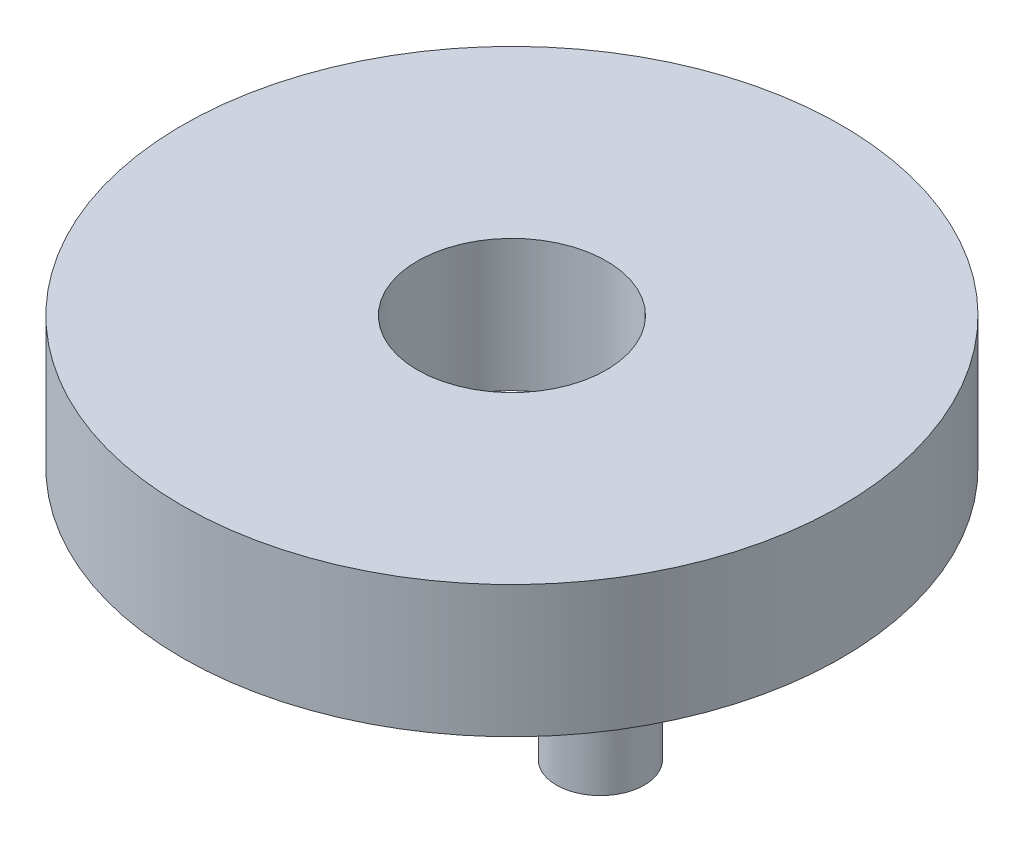
ISO-10303-21;
HEADER;
FILE_DESCRIPTION(('STEP AP214'),'2;1');
FILE_NAME('part.step','',(''),(''),'','','');
FILE_SCHEMA(('AUTOMOTIVE_DESIGN { 1 0 10303 214 1 1 1 1 }'));
ENDSEC;
DATA;
#1=APPLICATION_CONTEXT('core data for automotive mechanical design processes');
#2=APPLICATION_PROTOCOL_DEFINITION('international standard','automotive_design',2000,#1);
#3=PRODUCT_CONTEXT('',#1,'mechanical');
#4=PRODUCT('Part','Part','',(#3));
#5=PRODUCT_RELATED_PRODUCT_CATEGORY('part','',(#4));
#6=PRODUCT_DEFINITION_FORMATION('','',#4);
#7=PRODUCT_DEFINITION_CONTEXT('part definition',#1,'design');
#8=PRODUCT_DEFINITION('design','',#6,#7);
#9=PRODUCT_DEFINITION_SHAPE('','',#8);
#10=(LENGTH_UNIT() NAMED_UNIT(*) SI_UNIT(.MILLI.,.METRE.));
#11=(NAMED_UNIT(*) PLANE_ANGLE_UNIT() SI_UNIT($,.RADIAN.));
#12=(NAMED_UNIT(*) SI_UNIT($,.STERADIAN.) SOLID_ANGLE_UNIT());
#13=UNCERTAINTY_MEASURE_WITH_UNIT(LENGTH_MEASURE(1.E-05),#10,'distance_accuracy_value','');
#14=(GEOMETRIC_REPRESENTATION_CONTEXT(3) GLOBAL_UNCERTAINTY_ASSIGNED_CONTEXT((#13)) GLOBAL_UNIT_ASSIGNED_CONTEXT((#10,
#11,#12)) REPRESENTATION_CONTEXT('',''));
#15=CARTESIAN_POINT('',(0.,0.,0.));
#16=DIRECTION('',(0.,0.,1.));
#17=DIRECTION('',(1.,0.,0.));
#18=AXIS2_PLACEMENT_3D('',#15,#16,#17);
#19=CARTESIAN_POINT('',(0.,3.,0.));
#20=DIRECTION('',(0.,-1.,0.));
#21=DIRECTION('',(0.,0.,-1.));
#22=AXIS2_PLACEMENT_3D('',#19,#20,#21);
#23=CYLINDRICAL_SURFACE('',#22,7.5);
#24=CARTESIAN_POINT('',(0.,3.,0.));
#25=DIRECTION('',(0.,1.,0.));
#26=DIRECTION('',(0.,0.,1.));
#27=AXIS2_PLACEMENT_3D('',#24,#25,#26);
#28=CIRCLE('',#27,7.5);
#29=CARTESIAN_POINT('',(0.,3.,7.5));
#30=VERTEX_POINT('',#29);
#31=EDGE_CURVE('E62',#30,#30,#28,.T.);
#32=ORIENTED_EDGE('',*,*,#31,.F.);
#33=EDGE_LOOP('',(#32));
#34=FACE_BOUND('',#33,.T.);
#35=CARTESIAN_POINT('',(0.,0.,0.));
#36=DIRECTION('',(0.,1.,0.));
#37=DIRECTION('',(0.,0.,1.));
#38=AXIS2_PLACEMENT_3D('',#35,#36,#37);
#39=CIRCLE('',#38,7.5);
#40=CARTESIAN_POINT('',(0.,0.,7.5));
#41=VERTEX_POINT('',#40);
#42=EDGE_CURVE('E65',#41,#41,#39,.T.);
#43=ORIENTED_EDGE('',*,*,#42,.T.);
#44=EDGE_LOOP('',(#43));
#45=FACE_BOUND('',#44,.T.);
#46=ADVANCED_FACE('F43',(#34,#45),#23,.T.);
#47=CARTESIAN_POINT('',(0.,3.,0.));
#48=DIRECTION('',(0.,1.,0.));
#49=DIRECTION('',(0.,0.,1.));
#50=AXIS2_PLACEMENT_3D('',#47,#48,#49);
#51=PLANE('',#50);
#52=CARTESIAN_POINT('',(0.,3.,0.));
#53=DIRECTION('',(0.,1.,0.));
#54=DIRECTION('',(0.,0.,1.));
#55=AXIS2_PLACEMENT_3D('',#52,#53,#54);
#56=CIRCLE('',#55,2.14999999999999);
#57=CARTESIAN_POINT('',(0.,3.,2.14999999999999));
#58=VERTEX_POINT('',#57);
#59=EDGE_CURVE('E76',#58,#58,#56,.T.);
#60=ORIENTED_EDGE('',*,*,#59,.F.);
#61=EDGE_LOOP('',(#60));
#62=FACE_BOUND('',#61,.T.);
#63=ORIENTED_EDGE('',*,*,#31,.T.);
#64=EDGE_LOOP('',(#63));
#65=FACE_BOUND('',#64,.T.);
#66=ADVANCED_FACE('F109',(#62,#65),#51,.T.);
#67=CARTESIAN_POINT('',(0.,0.,0.));
#68=DIRECTION('',(0.,1.,0.));
#69=DIRECTION('',(0.,0.,1.));
#70=AXIS2_PLACEMENT_3D('',#67,#68,#69);
#71=PLANE('',#70);
#72=CARTESIAN_POINT('',(-4.76313972081442,0.,2.74999999999999));
#73=DIRECTION('',(0.,1.,0.));
#74=DIRECTION('',(0.,0.,1.));
#75=AXIS2_PLACEMENT_3D('',#72,#73,#74);
#76=CIRCLE('',#75,1.);
#77=CARTESIAN_POINT('',(-4.76313972081442,0.,3.74999999999999));
#78=VERTEX_POINT('',#77);
#79=EDGE_CURVE('E10',#78,#78,#76,.F.);
#80=ORIENTED_EDGE('',*,*,#79,.F.);
#81=EDGE_LOOP('',(#80));
#82=FACE_BOUND('',#81,.T.);
#83=CARTESIAN_POINT('',(4.76313972081442,0.,2.74999999999999));
#84=DIRECTION('',(0.,1.,0.));
#85=DIRECTION('',(0.,0.,1.));
#86=AXIS2_PLACEMENT_3D('',#83,#84,#85);
#87=CIRCLE('',#86,1.);
#88=CARTESIAN_POINT('',(4.76313972081442,0.,3.74999999999999));
#89=VERTEX_POINT('',#88);
#90=EDGE_CURVE('E50',#89,#89,#87,.F.);
#91=ORIENTED_EDGE('',*,*,#90,.F.);
#92=EDGE_LOOP('',(#91));
#93=FACE_BOUND('',#92,.T.);
#94=CARTESIAN_POINT('',(0.,0.,-5.5));
#95=DIRECTION('',(0.,1.,0.));
#96=DIRECTION('',(0.,0.,1.));
#97=AXIS2_PLACEMENT_3D('',#94,#95,#96);
#98=CIRCLE('',#97,1.);
#99=CARTESIAN_POINT('',(0.,0.,-4.5));
#100=VERTEX_POINT('',#99);
#101=EDGE_CURVE('E56',#100,#100,#98,.F.);
#102=ORIENTED_EDGE('',*,*,#101,.F.);
#103=EDGE_LOOP('',(#102));
#104=FACE_BOUND('',#103,.T.);
#105=CARTESIAN_POINT('',(0.,0.,0.));
#106=DIRECTION('',(0.,1.,0.));
#107=DIRECTION('',(0.,0.,1.));
#108=AXIS2_PLACEMENT_3D('',#105,#106,#107);
#109=CIRCLE('',#108,2.14999999999999);
#110=CARTESIAN_POINT('',(0.,0.,2.14999999999999));
#111=VERTEX_POINT('',#110);
#112=EDGE_CURVE('E69',#111,#111,#109,.T.);
#113=ORIENTED_EDGE('',*,*,#112,.T.);
#114=EDGE_LOOP('',(#113));
#115=FACE_BOUND('',#114,.T.);
#116=ORIENTED_EDGE('',*,*,#42,.F.);
#117=EDGE_LOOP('',(#116));
#118=FACE_BOUND('',#117,.T.);
#119=ADVANCED_FACE('F115',(#82,#93,#104,#115,#118),#71,.F.);
#120=CARTESIAN_POINT('',(0.,3.,0.));
#121=DIRECTION('',(0.,1.,0.));
#122=DIRECTION('',(0.,0.,1.));
#123=AXIS2_PLACEMENT_3D('',#120,#121,#122);
#124=CYLINDRICAL_SURFACE('',#123,2.14999999999999);
#125=ORIENTED_EDGE('',*,*,#112,.F.);
#126=EDGE_LOOP('',(#125));
#127=FACE_BOUND('',#126,.T.);
#128=ORIENTED_EDGE('',*,*,#59,.T.);
#129=EDGE_LOOP('',(#128));
#130=FACE_BOUND('',#129,.T.);
#131=ADVANCED_FACE('F123',(#127,#130),#124,.F.);
#132=CARTESIAN_POINT('',(0.,-2.,-5.5));
#133=DIRECTION('',(0.,1.,0.));
#134=DIRECTION('',(0.,0.,1.));
#135=AXIS2_PLACEMENT_3D('',#132,#133,#134);
#136=CYLINDRICAL_SURFACE('',#135,1.);
#137=CARTESIAN_POINT('',(0.,-2.,-5.5));
#138=DIRECTION('',(0.,-1.,0.));
#139=DIRECTION('',(0.,0.,-1.));
#140=AXIS2_PLACEMENT_3D('',#137,#138,#139);
#141=CIRCLE('',#140,1.);
#142=CARTESIAN_POINT('',(0.,-2.,-6.5));
#143=VERTEX_POINT('',#142);
#144=EDGE_CURVE('E80',#143,#143,#141,.T.);
#145=ORIENTED_EDGE('',*,*,#144,.F.);
#146=EDGE_LOOP('',(#145));
#147=FACE_BOUND('',#146,.T.);
#148=ORIENTED_EDGE('',*,*,#101,.T.);
#149=EDGE_LOOP('',(#148));
#150=FACE_BOUND('',#149,.T.);
#151=ADVANCED_FACE('F128',(#147,#150),#136,.T.);
#152=CARTESIAN_POINT('',(0.,-2.,-5.5));
#153=DIRECTION('',(0.,-1.,0.));
#154=DIRECTION('',(0.,0.,-1.));
#155=AXIS2_PLACEMENT_3D('',#152,#153,#154);
#156=PLANE('',#155);
#157=ORIENTED_EDGE('',*,*,#144,.T.);
#158=EDGE_LOOP('',(#157));
#159=FACE_BOUND('',#158,.T.);
#160=ADVANCED_FACE('F135',(#159),#156,.T.);
#161=CARTESIAN_POINT('',(4.76313972081442,-2.,2.74999999999999));
#162=DIRECTION('',(0.,1.,0.));
#163=DIRECTION('',(0.,0.,1.));
#164=AXIS2_PLACEMENT_3D('',#161,#162,#163);
#165=CYLINDRICAL_SURFACE('',#164,1.);
#166=CARTESIAN_POINT('',(4.76313972081442,-2.,2.74999999999999));
#167=DIRECTION('',(0.,-1.,0.));
#168=DIRECTION('',(0.,0.,-1.));
#169=AXIS2_PLACEMENT_3D('',#166,#167,#168);
#170=CIRCLE('',#169,1.);
#171=CARTESIAN_POINT('',(4.76313972081442,-2.,1.74999999999999));
#172=VERTEX_POINT('',#171);
#173=EDGE_CURVE('E84',#172,#172,#170,.T.);
#174=ORIENTED_EDGE('',*,*,#173,.F.);
#175=EDGE_LOOP('',(#174));
#176=FACE_BOUND('',#175,.T.);
#177=ORIENTED_EDGE('',*,*,#90,.T.);
#178=EDGE_LOOP('',(#177));
#179=FACE_BOUND('',#178,.T.);
#180=ADVANCED_FACE('F105',(#176,#179),#165,.T.);
#181=CARTESIAN_POINT('',(4.76313972081442,-2.,2.74999999999999));
#182=DIRECTION('',(0.,-1.,0.));
#183=DIRECTION('',(0.,0.,-1.));
#184=AXIS2_PLACEMENT_3D('',#181,#182,#183);
#185=PLANE('',#184);
#186=ORIENTED_EDGE('',*,*,#173,.T.);
#187=EDGE_LOOP('',(#186));
#188=FACE_BOUND('',#187,.T.);
#189=ADVANCED_FACE('F98',(#188),#185,.T.);
#190=CARTESIAN_POINT('',(-4.76313972081442,-2.,2.74999999999999));
#191=DIRECTION('',(0.,1.,0.));
#192=DIRECTION('',(0.,0.,1.));
#193=AXIS2_PLACEMENT_3D('',#190,#191,#192);
#194=CYLINDRICAL_SURFACE('',#193,1.);
#195=CARTESIAN_POINT('',(-4.76313972081442,-2.,2.74999999999999));
#196=DIRECTION('',(0.,-1.,0.));
#197=DIRECTION('',(0.,0.,-1.));
#198=AXIS2_PLACEMENT_3D('',#195,#196,#197);
#199=CIRCLE('',#198,1.);
#200=CARTESIAN_POINT('',(-4.76313972081442,-2.,1.74999999999999));
#201=VERTEX_POINT('',#200);
#202=EDGE_CURVE('E88',#201,#201,#199,.T.);
#203=ORIENTED_EDGE('',*,*,#202,.F.);
#204=EDGE_LOOP('',(#203));
#205=FACE_BOUND('',#204,.T.);
#206=ORIENTED_EDGE('',*,*,#79,.T.);
#207=EDGE_LOOP('',(#206));
#208=FACE_BOUND('',#207,.T.);
#209=ADVANCED_FACE('F96',(#205,#208),#194,.T.);
#210=CARTESIAN_POINT('',(-4.76313972081442,-2.,2.74999999999999));
#211=DIRECTION('',(0.,-1.,0.));
#212=DIRECTION('',(0.,0.,-1.));
#213=AXIS2_PLACEMENT_3D('',#210,#211,#212);
#214=PLANE('',#213);
#215=ORIENTED_EDGE('',*,*,#202,.T.);
#216=EDGE_LOOP('',(#215));
#217=FACE_BOUND('',#216,.T.);
#218=ADVANCED_FACE('F94',(#217),#214,.T.);
#219=CLOSED_SHELL('',(#46,#66,#119,#131,#151,#160,#180,#189,#209,#218));
#220=MANIFOLD_SOLID_BREP('B2',#219);
#221=ADVANCED_BREP_SHAPE_REPRESENTATION('',(#18,#220),#14);
#222=SHAPE_DEFINITION_REPRESENTATION(#9,#221);
ENDSEC;
END-ISO-10303-21;
